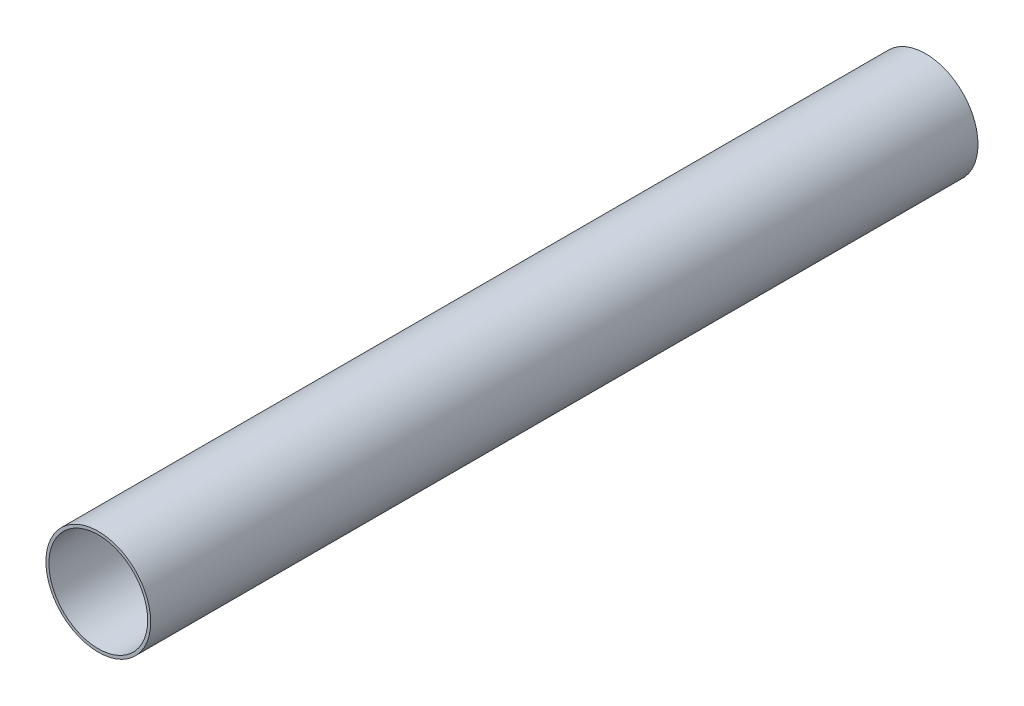
ISO-10303-21;
HEADER;
FILE_DESCRIPTION(('STEP AP214'),'2;1');
FILE_NAME('part.step','',(''),(''),'','','');
FILE_SCHEMA(('AUTOMOTIVE_DESIGN { 1 0 10303 214 1 1 1 1 }'));
ENDSEC;
DATA;
#1=APPLICATION_CONTEXT('core data for automotive mechanical design processes');
#2=APPLICATION_PROTOCOL_DEFINITION('international standard','automotive_design',2000,#1);
#3=PRODUCT_CONTEXT('',#1,'mechanical');
#4=PRODUCT('Part','Part','',(#3));
#5=PRODUCT_RELATED_PRODUCT_CATEGORY('part','',(#4));
#6=PRODUCT_DEFINITION_FORMATION('','',#4);
#7=PRODUCT_DEFINITION_CONTEXT('part definition',#1,'design');
#8=PRODUCT_DEFINITION('design','',#6,#7);
#9=PRODUCT_DEFINITION_SHAPE('','',#8);
#10=(LENGTH_UNIT() NAMED_UNIT(*) SI_UNIT(.MILLI.,.METRE.));
#11=(NAMED_UNIT(*) PLANE_ANGLE_UNIT() SI_UNIT($,.RADIAN.));
#12=(NAMED_UNIT(*) SI_UNIT($,.STERADIAN.) SOLID_ANGLE_UNIT());
#13=UNCERTAINTY_MEASURE_WITH_UNIT(LENGTH_MEASURE(1.E-05),#10,'distance_accuracy_value','');
#14=(GEOMETRIC_REPRESENTATION_CONTEXT(3) GLOBAL_UNCERTAINTY_ASSIGNED_CONTEXT((#13)) GLOBAL_UNIT_ASSIGNED_CONTEXT((#10,
#11,#12)) REPRESENTATION_CONTEXT('',''));
#15=CARTESIAN_POINT('',(0.,0.,0.));
#16=DIRECTION('',(0.,0.,1.));
#17=DIRECTION('',(1.,0.,0.));
#18=AXIS2_PLACEMENT_3D('',#15,#16,#17);
#19=CARTESIAN_POINT('',(0.,0.,696.976));
#20=DIRECTION('',(0.,0.,1.));
#21=DIRECTION('',(1.,0.,0.));
#22=AXIS2_PLACEMENT_3D('',#19,#20,#21);
#23=PLANE('',#22);
#24=CARTESIAN_POINT('',(0.,0.,696.976));
#25=DIRECTION('',(0.,0.,1.));
#26=DIRECTION('',(1.,0.,0.));
#27=AXIS2_PLACEMENT_3D('',#24,#25,#26);
#28=CIRCLE('',#27,44.1325);
#29=CARTESIAN_POINT('',(44.1325,0.,696.976));
#30=VERTEX_POINT('',#29);
#31=EDGE_CURVE('E10',#30,#30,#28,.T.);
#32=ORIENTED_EDGE('',*,*,#31,.T.);
#33=EDGE_LOOP('',(#32));
#34=FACE_BOUND('',#33,.T.);
#35=CARTESIAN_POINT('',(0.,0.,696.976));
#36=DIRECTION('',(0.,0.,1.));
#37=DIRECTION('',(1.,0.,0.));
#38=AXIS2_PLACEMENT_3D('',#35,#36,#37);
#39=CIRCLE('',#38,41.5925);
#40=CARTESIAN_POINT('',(41.5925,0.,696.976));
#41=VERTEX_POINT('',#40);
#42=EDGE_CURVE('E50',#41,#41,#39,.T.);
#43=ORIENTED_EDGE('',*,*,#42,.F.);
#44=EDGE_LOOP('',(#43));
#45=FACE_BOUND('',#44,.T.);
#46=ADVANCED_FACE('F37',(#34,#45),#23,.T.);
#47=CARTESIAN_POINT('',(0.,0.,0.));
#48=DIRECTION('',(0.,0.,1.));
#49=DIRECTION('',(1.,0.,0.));
#50=AXIS2_PLACEMENT_3D('',#47,#48,#49);
#51=PLANE('',#50);
#52=CARTESIAN_POINT('',(0.,0.,0.));
#53=DIRECTION('',(0.,0.,1.));
#54=DIRECTION('',(1.,0.,0.));
#55=AXIS2_PLACEMENT_3D('',#52,#53,#54);
#56=CIRCLE('',#55,44.1325);
#57=CARTESIAN_POINT('',(44.1325,0.,0.));
#58=VERTEX_POINT('',#57);
#59=EDGE_CURVE('E41',#58,#58,#56,.T.);
#60=ORIENTED_EDGE('',*,*,#59,.F.);
#61=EDGE_LOOP('',(#60));
#62=FACE_BOUND('',#61,.T.);
#63=CARTESIAN_POINT('',(0.,0.,0.));
#64=DIRECTION('',(0.,0.,1.));
#65=DIRECTION('',(1.,0.,0.));
#66=AXIS2_PLACEMENT_3D('',#63,#64,#65);
#67=CIRCLE('',#66,41.5925);
#68=CARTESIAN_POINT('',(41.5925,0.,0.));
#69=VERTEX_POINT('',#68);
#70=EDGE_CURVE('E52',#69,#69,#67,.T.);
#71=ORIENTED_EDGE('',*,*,#70,.T.);
#72=EDGE_LOOP('',(#71));
#73=FACE_BOUND('',#72,.T.);
#74=ADVANCED_FACE('F64',(#62,#73),#51,.F.);
#75=CARTESIAN_POINT('',(0.,0.,696.976));
#76=DIRECTION('',(0.,0.,-1.));
#77=DIRECTION('',(-1.,0.,0.));
#78=AXIS2_PLACEMENT_3D('',#75,#76,#77);
#79=CYLINDRICAL_SURFACE('',#78,44.1325);
#80=ORIENTED_EDGE('',*,*,#31,.F.);
#81=EDGE_LOOP('',(#80));
#82=FACE_BOUND('',#81,.T.);
#83=ORIENTED_EDGE('',*,*,#59,.T.);
#84=EDGE_LOOP('',(#83));
#85=FACE_BOUND('',#84,.T.);
#86=ADVANCED_FACE('F39',(#82,#85),#79,.T.);
#87=CARTESIAN_POINT('',(0.,0.,696.976));
#88=DIRECTION('',(0.,0.,-1.));
#89=DIRECTION('',(-1.,0.,0.));
#90=AXIS2_PLACEMENT_3D('',#87,#88,#89);
#91=CYLINDRICAL_SURFACE('',#90,41.5925);
#92=ORIENTED_EDGE('',*,*,#42,.T.);
#93=EDGE_LOOP('',(#92));
#94=FACE_BOUND('',#93,.T.);
#95=ORIENTED_EDGE('',*,*,#70,.F.);
#96=EDGE_LOOP('',(#95));
#97=FACE_BOUND('',#96,.T.);
#98=ADVANCED_FACE('F60',(#94,#97),#91,.F.);
#99=CLOSED_SHELL('',(#46,#74,#86,#98));
#100=MANIFOLD_SOLID_BREP('B2',#99);
#101=ADVANCED_BREP_SHAPE_REPRESENTATION('',(#18,#100),#14);
#102=SHAPE_DEFINITION_REPRESENTATION(#9,#101);
ENDSEC;
END-ISO-10303-21;
